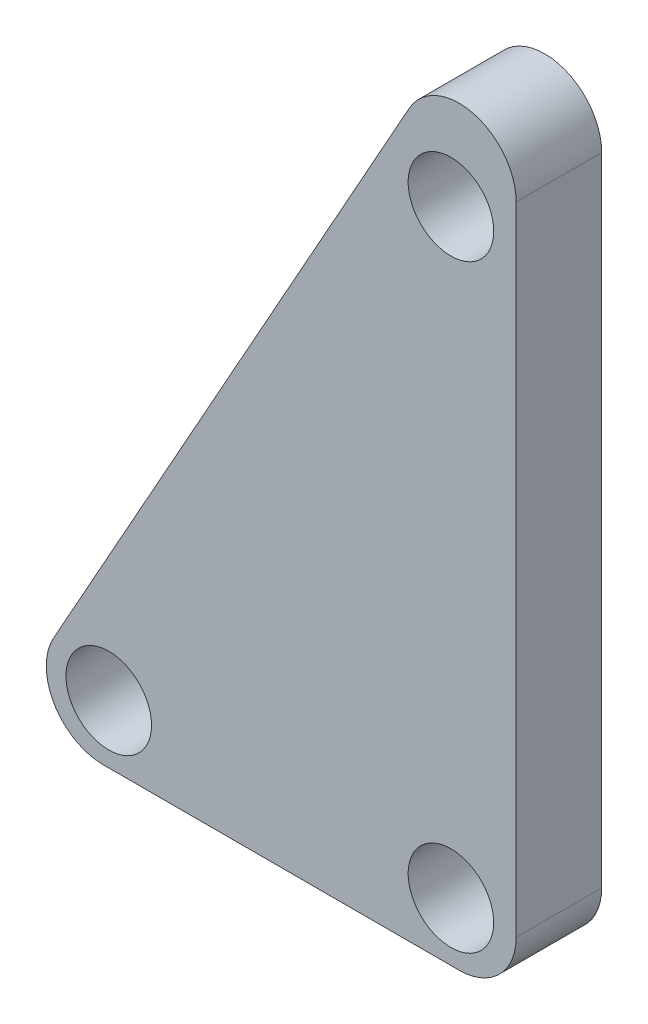
ISO-10303-21;
HEADER;
FILE_DESCRIPTION(('STEP AP214'),'2;1');
FILE_NAME('part.step','',(''),(''),'','','');
FILE_SCHEMA(('AUTOMOTIVE_DESIGN { 1 0 10303 214 1 1 1 1 }'));
ENDSEC;
DATA;
#1=APPLICATION_CONTEXT('core data for automotive mechanical design processes');
#2=APPLICATION_PROTOCOL_DEFINITION('international standard','automotive_design',2000,#1);
#3=PRODUCT_CONTEXT('',#1,'mechanical');
#4=PRODUCT('Part','Part','',(#3));
#5=PRODUCT_RELATED_PRODUCT_CATEGORY('part','',(#4));
#6=PRODUCT_DEFINITION_FORMATION('','',#4);
#7=PRODUCT_DEFINITION_CONTEXT('part definition',#1,'design');
#8=PRODUCT_DEFINITION('design','',#6,#7);
#9=PRODUCT_DEFINITION_SHAPE('','',#8);
#10=(LENGTH_UNIT() NAMED_UNIT(*) SI_UNIT(.MILLI.,.METRE.));
#11=(NAMED_UNIT(*) PLANE_ANGLE_UNIT() SI_UNIT($,.RADIAN.));
#12=(NAMED_UNIT(*) SI_UNIT($,.STERADIAN.) SOLID_ANGLE_UNIT());
#13=UNCERTAINTY_MEASURE_WITH_UNIT(LENGTH_MEASURE(1.E-05),#10,'distance_accuracy_value','');
#14=(GEOMETRIC_REPRESENTATION_CONTEXT(3) GLOBAL_UNCERTAINTY_ASSIGNED_CONTEXT((#13)) GLOBAL_UNIT_ASSIGNED_CONTEXT((#10,
#11,#12)) REPRESENTATION_CONTEXT('',''));
#15=CARTESIAN_POINT('',(0.,0.,0.));
#16=DIRECTION('',(0.,0.,1.));
#17=DIRECTION('',(1.,0.,0.));
#18=AXIS2_PLACEMENT_3D('',#15,#16,#17);
#19=CARTESIAN_POINT('',(-20.,243.342145584701,30.));
#20=DIRECTION('',(0.,0.,-1.));
#21=DIRECTION('',(-1.,0.,0.));
#22=AXIS2_PLACEMENT_3D('',#19,#20,#21);
#23=PLANE('',#22);
#24=CARTESIAN_POINT('',(-20.,243.342145584701,30.));
#25=DIRECTION('',(0.,0.,1.));
#26=DIRECTION('',(-1.,0.,0.));
#27=AXIS2_PLACEMENT_3D('',#24,#25,#26);
#28=CIRCLE('',#27,20.);
#29=CARTESIAN_POINT('',(0.,243.342145584701,30.));
#30=VERTEX_POINT('',#29);
#31=CARTESIAN_POINT('',(-37.4597186449705,253.097053315606,30.));
#32=VERTEX_POINT('',#31);
#33=EDGE_CURVE('E133',#30,#32,#28,.T.);
#34=ORIENTED_EDGE('',*,*,#33,.T.);
#35=DIRECTION('',(-0.487745386545245,-0.872985932248527,0.));
#36=VECTOR('',#35,1.);
#37=CARTESIAN_POINT('',(-162.243059482406,29.7549077309049,30.));
#38=LINE('',#37,#36);
#39=CARTESIAN_POINT('',(-162.243059482406,29.7549077309049,30.));
#40=VERTEX_POINT('',#39);
#41=EDGE_CURVE('E91',#32,#40,#38,.T.);
#42=ORIENTED_EDGE('',*,*,#41,.T.);
#43=CARTESIAN_POINT('',(-144.783340837436,20.,30.));
#44=DIRECTION('',(0.,0.,1.));
#45=DIRECTION('',(-1.,0.,0.));
#46=AXIS2_PLACEMENT_3D('',#43,#44,#45);
#47=CIRCLE('',#46,20.);
#48=CARTESIAN_POINT('',(-144.783340837436,0.,30.));
#49=VERTEX_POINT('',#48);
#50=EDGE_CURVE('E104',#40,#49,#47,.T.);
#51=ORIENTED_EDGE('',*,*,#50,.T.);
#52=DIRECTION('',(1.,0.,0.));
#53=VECTOR('',#52,1.);
#54=CARTESIAN_POINT('',(-20.0000000000001,0.,30.));
#55=LINE('',#54,#53);
#56=CARTESIAN_POINT('',(-20.0000000000001,0.,30.));
#57=VERTEX_POINT('',#56);
#58=EDGE_CURVE('E98',#49,#57,#55,.T.);
#59=ORIENTED_EDGE('',*,*,#58,.T.);
#60=CARTESIAN_POINT('',(-20.,20.,30.));
#61=DIRECTION('',(0.,0.,1.));
#62=DIRECTION('',(1.,0.,0.));
#63=AXIS2_PLACEMENT_3D('',#60,#61,#62);
#64=CIRCLE('',#63,20.);
#65=CARTESIAN_POINT('',(0.,20.,30.));
#66=VERTEX_POINT('',#65);
#67=EDGE_CURVE('E102',#57,#66,#64,.T.);
#68=ORIENTED_EDGE('',*,*,#67,.T.);
#69=DIRECTION('',(0.,1.,0.));
#70=VECTOR('',#69,1.);
#71=CARTESIAN_POINT('',(0.,243.342145584701,30.));
#72=LINE('',#71,#70);
#73=EDGE_CURVE('E54',#66,#30,#72,.T.);
#74=ORIENTED_EDGE('',*,*,#73,.T.);
#75=EDGE_LOOP('',(#34,#42,#51,#59,#68,#74));
#76=FACE_BOUND('',#75,.T.);
#77=CARTESIAN_POINT('',(-22.8788887645735,230.463472559632,30.));
#78=DIRECTION('',(0.,0.,1.));
#79=DIRECTION('',(1.,0.,0.));
#80=AXIS2_PLACEMENT_3D('',#77,#78,#79);
#81=CIRCLE('',#80,15.);
#82=CARTESIAN_POINT('',(-7.87888876457353,230.463472559632,30.));
#83=VERTEX_POINT('',#82);
#84=EDGE_CURVE('E126',#83,#83,#81,.T.);
#85=ORIENTED_EDGE('',*,*,#84,.F.);
#86=EDGE_LOOP('',(#85));
#87=FACE_BOUND('',#86,.T.);
#88=CARTESIAN_POINT('',(-22.8788887645735,20.463472559632,30.));
#89=DIRECTION('',(0.,0.,1.));
#90=DIRECTION('',(1.,0.,0.));
#91=AXIS2_PLACEMENT_3D('',#88,#89,#90);
#92=CIRCLE('',#91,15.);
#93=CARTESIAN_POINT('',(-7.8788887645735,20.463472559632,30.));
#94=VERTEX_POINT('',#93);
#95=EDGE_CURVE('E187',#94,#94,#92,.T.);
#96=ORIENTED_EDGE('',*,*,#95,.F.);
#97=EDGE_LOOP('',(#96));
#98=FACE_BOUND('',#97,.T.);
#99=CARTESIAN_POINT('',(-142.878888764574,20.463472559632,30.));
#100=DIRECTION('',(0.,0.,1.));
#101=DIRECTION('',(1.,0.,0.));
#102=AXIS2_PLACEMENT_3D('',#99,#100,#101);
#103=CIRCLE('',#102,15.);
#104=CARTESIAN_POINT('',(-127.878888764573,20.463472559632,30.));
#105=VERTEX_POINT('',#104);
#106=EDGE_CURVE('E178',#105,#105,#103,.T.);
#107=ORIENTED_EDGE('',*,*,#106,.F.);
#108=EDGE_LOOP('',(#107));
#109=FACE_BOUND('',#108,.T.);
#110=ADVANCED_FACE('F37',(#76,#87,#98,#109),#23,.F.);
#111=CARTESIAN_POINT('',(-20.,243.342145584701,0.));
#112=DIRECTION('',(0.,0.,-1.));
#113=DIRECTION('',(-1.,0.,0.));
#114=AXIS2_PLACEMENT_3D('',#111,#112,#113);
#115=PLANE('',#114);
#116=CARTESIAN_POINT('',(-22.8788887645735,20.463472559632,0.));
#117=DIRECTION('',(0.,0.,1.));
#118=DIRECTION('',(1.,0.,0.));
#119=AXIS2_PLACEMENT_3D('',#116,#117,#118);
#120=CIRCLE('',#119,15.);
#121=CARTESIAN_POINT('',(-7.8788887645735,20.463472559632,0.));
#122=VERTEX_POINT('',#121);
#123=EDGE_CURVE('E184',#122,#122,#120,.T.);
#124=ORIENTED_EDGE('',*,*,#123,.T.);
#125=EDGE_LOOP('',(#124));
#126=FACE_BOUND('',#125,.T.);
#127=CARTESIAN_POINT('',(-20.,243.342145584701,0.));
#128=DIRECTION('',(0.,0.,1.));
#129=DIRECTION('',(-1.,0.,0.));
#130=AXIS2_PLACEMENT_3D('',#127,#128,#129);
#131=CIRCLE('',#130,20.);
#132=CARTESIAN_POINT('',(0.,243.342145584701,0.));
#133=VERTEX_POINT('',#132);
#134=CARTESIAN_POINT('',(-37.4597186449705,253.097053315606,0.));
#135=VERTEX_POINT('',#134);
#136=EDGE_CURVE('E122',#133,#135,#131,.T.);
#137=ORIENTED_EDGE('',*,*,#136,.F.);
#138=DIRECTION('',(0.,1.,0.));
#139=VECTOR('',#138,1.);
#140=CARTESIAN_POINT('',(0.,243.342145584701,0.));
#141=LINE('',#140,#139);
#142=CARTESIAN_POINT('',(0.,20.,0.));
#143=VERTEX_POINT('',#142);
#144=EDGE_CURVE('E83',#143,#133,#141,.T.);
#145=ORIENTED_EDGE('',*,*,#144,.F.);
#146=CARTESIAN_POINT('',(-20.,20.,0.));
#147=DIRECTION('',(0.,0.,1.));
#148=DIRECTION('',(1.,0.,0.));
#149=AXIS2_PLACEMENT_3D('',#146,#147,#148);
#150=CIRCLE('',#149,20.);
#151=CARTESIAN_POINT('',(-20.0000000000001,0.,0.));
#152=VERTEX_POINT('',#151);
#153=EDGE_CURVE('E77',#152,#143,#150,.T.);
#154=ORIENTED_EDGE('',*,*,#153,.F.);
#155=DIRECTION('',(1.,0.,0.));
#156=VECTOR('',#155,1.);
#157=CARTESIAN_POINT('',(-20.0000000000001,0.,0.));
#158=LINE('',#157,#156);
#159=CARTESIAN_POINT('',(-144.783340837436,0.,0.));
#160=VERTEX_POINT('',#159);
#161=EDGE_CURVE('E112',#160,#152,#158,.T.);
#162=ORIENTED_EDGE('',*,*,#161,.F.);
#163=CARTESIAN_POINT('',(-144.783340837436,20.,0.));
#164=DIRECTION('',(0.,0.,1.));
#165=DIRECTION('',(-1.,0.,0.));
#166=AXIS2_PLACEMENT_3D('',#163,#164,#165);
#167=CIRCLE('',#166,20.);
#168=CARTESIAN_POINT('',(-162.243059482406,29.7549077309049,0.));
#169=VERTEX_POINT('',#168);
#170=EDGE_CURVE('E128',#169,#160,#167,.T.);
#171=ORIENTED_EDGE('',*,*,#170,.F.);
#172=DIRECTION('',(-0.487745386545245,-0.872985932248527,0.));
#173=VECTOR('',#172,1.);
#174=CARTESIAN_POINT('',(-162.243059482406,29.7549077309049,0.));
#175=LINE('',#174,#173);
#176=EDGE_CURVE('E125',#135,#169,#175,.T.);
#177=ORIENTED_EDGE('',*,*,#176,.F.);
#178=EDGE_LOOP('',(#137,#145,#154,#162,#171,#177));
#179=FACE_BOUND('',#178,.T.);
#180=CARTESIAN_POINT('',(-22.8788887645735,230.463472559632,0.));
#181=DIRECTION('',(0.,0.,1.));
#182=DIRECTION('',(1.,0.,0.));
#183=AXIS2_PLACEMENT_3D('',#180,#181,#182);
#184=CIRCLE('',#183,15.);
#185=CARTESIAN_POINT('',(-7.87888876457353,230.463472559632,0.));
#186=VERTEX_POINT('',#185);
#187=EDGE_CURVE('E190',#186,#186,#184,.T.);
#188=ORIENTED_EDGE('',*,*,#187,.T.);
#189=EDGE_LOOP('',(#188));
#190=FACE_BOUND('',#189,.T.);
#191=CARTESIAN_POINT('',(-142.878888764574,20.463472559632,0.));
#192=DIRECTION('',(0.,0.,1.));
#193=DIRECTION('',(1.,0.,0.));
#194=AXIS2_PLACEMENT_3D('',#191,#192,#193);
#195=CIRCLE('',#194,15.);
#196=CARTESIAN_POINT('',(-127.878888764573,20.463472559632,0.));
#197=VERTEX_POINT('',#196);
#198=EDGE_CURVE('E181',#197,#197,#195,.T.);
#199=ORIENTED_EDGE('',*,*,#198,.T.);
#200=EDGE_LOOP('',(#199));
#201=FACE_BOUND('',#200,.T.);
#202=ADVANCED_FACE('F142',(#126,#179,#190,#201),#115,.T.);
#203=CARTESIAN_POINT('',(-20.,243.342145584701,30.));
#204=DIRECTION('',(0.,0.,-1.));
#205=DIRECTION('',(-1.,0.,0.));
#206=AXIS2_PLACEMENT_3D('',#203,#204,#205);
#207=CYLINDRICAL_SURFACE('',#206,20.);
#208=ORIENTED_EDGE('',*,*,#136,.T.);
#209=DIRECTION('',(0.,0.,-1.));
#210=VECTOR('',#209,1.);
#211=CARTESIAN_POINT('',(-37.4597186449705,253.097053315606,30.));
#212=LINE('',#211,#210);
#213=EDGE_CURVE('E11',#32,#135,#212,.T.);
#214=ORIENTED_EDGE('',*,*,#213,.F.);
#215=ORIENTED_EDGE('',*,*,#33,.F.);
#216=DIRECTION('',(0.,0.,-1.));
#217=VECTOR('',#216,1.);
#218=CARTESIAN_POINT('',(0.,243.342145584701,30.));
#219=LINE('',#218,#217);
#220=EDGE_CURVE('E118',#30,#133,#219,.T.);
#221=ORIENTED_EDGE('',*,*,#220,.T.);
#222=EDGE_LOOP('',(#208,#214,#215,#221));
#223=FACE_BOUND('',#222,.T.);
#224=ADVANCED_FACE('F39',(#223),#207,.T.);
#225=CARTESIAN_POINT('',(-162.243059482406,29.7549077309049,30.));
#226=DIRECTION('',(0.872985932248527,-0.487745386545245,0.));
#227=DIRECTION('',(0.487745386545245,0.872985932248527,0.));
#228=AXIS2_PLACEMENT_3D('',#225,#226,#227);
#229=PLANE('',#228);
#230=ORIENTED_EDGE('',*,*,#176,.T.);
#231=DIRECTION('',(0.,0.,-1.));
#232=VECTOR('',#231,1.);
#233=CARTESIAN_POINT('',(-162.243059482406,29.7549077309049,30.));
#234=LINE('',#233,#232);
#235=EDGE_CURVE('E46',#40,#169,#234,.T.);
#236=ORIENTED_EDGE('',*,*,#235,.F.);
#237=ORIENTED_EDGE('',*,*,#41,.F.);
#238=ORIENTED_EDGE('',*,*,#213,.T.);
#239=EDGE_LOOP('',(#230,#236,#237,#238));
#240=FACE_BOUND('',#239,.T.);
#241=ADVANCED_FACE('F245',(#240),#229,.F.);
#242=CARTESIAN_POINT('',(-144.783340837436,20.,30.));
#243=DIRECTION('',(0.,0.,-1.));
#244=DIRECTION('',(-1.,0.,0.));
#245=AXIS2_PLACEMENT_3D('',#242,#243,#244);
#246=CYLINDRICAL_SURFACE('',#245,20.);
#247=ORIENTED_EDGE('',*,*,#170,.T.);
#248=DIRECTION('',(0.,0.,-1.));
#249=VECTOR('',#248,1.);
#250=CARTESIAN_POINT('',(-144.783340837436,0.,30.));
#251=LINE('',#250,#249);
#252=EDGE_CURVE('E113',#49,#160,#251,.T.);
#253=ORIENTED_EDGE('',*,*,#252,.F.);
#254=ORIENTED_EDGE('',*,*,#50,.F.);
#255=ORIENTED_EDGE('',*,*,#235,.T.);
#256=EDGE_LOOP('',(#247,#253,#254,#255));
#257=FACE_BOUND('',#256,.T.);
#258=ADVANCED_FACE('F139',(#257),#246,.T.);
#259=CARTESIAN_POINT('',(-20.0000000000001,0.,30.));
#260=DIRECTION('',(0.,1.,0.));
#261=DIRECTION('',(0.,0.,1.));
#262=AXIS2_PLACEMENT_3D('',#259,#260,#261);
#263=PLANE('',#262);
#264=ORIENTED_EDGE('',*,*,#161,.T.);
#265=DIRECTION('',(0.,0.,-1.));
#266=VECTOR('',#265,1.);
#267=CARTESIAN_POINT('',(-20.0000000000001,0.,30.));
#268=LINE('',#267,#266);
#269=EDGE_CURVE('E109',#57,#152,#268,.T.);
#270=ORIENTED_EDGE('',*,*,#269,.F.);
#271=ORIENTED_EDGE('',*,*,#58,.F.);
#272=ORIENTED_EDGE('',*,*,#252,.T.);
#273=EDGE_LOOP('',(#264,#270,#271,#272));
#274=FACE_BOUND('',#273,.T.);
#275=ADVANCED_FACE('F110',(#274),#263,.F.);
#276=CARTESIAN_POINT('',(-20.,20.,30.));
#277=DIRECTION('',(0.,0.,-1.));
#278=DIRECTION('',(-1.,0.,0.));
#279=AXIS2_PLACEMENT_3D('',#276,#277,#278);
#280=CYLINDRICAL_SURFACE('',#279,20.);
#281=ORIENTED_EDGE('',*,*,#153,.T.);
#282=DIRECTION('',(0.,0.,-1.));
#283=VECTOR('',#282,1.);
#284=CARTESIAN_POINT('',(0.,20.,30.));
#285=LINE('',#284,#283);
#286=EDGE_CURVE('E114',#66,#143,#285,.T.);
#287=ORIENTED_EDGE('',*,*,#286,.F.);
#288=ORIENTED_EDGE('',*,*,#67,.F.);
#289=ORIENTED_EDGE('',*,*,#269,.T.);
#290=EDGE_LOOP('',(#281,#287,#288,#289));
#291=FACE_BOUND('',#290,.T.);
#292=ADVANCED_FACE('F116',(#291),#280,.T.);
#293=CARTESIAN_POINT('',(0.,243.342145584701,30.));
#294=DIRECTION('',(-1.,0.,0.));
#295=DIRECTION('',(0.,0.,1.));
#296=AXIS2_PLACEMENT_3D('',#293,#294,#295);
#297=PLANE('',#296);
#298=ORIENTED_EDGE('',*,*,#144,.T.);
#299=ORIENTED_EDGE('',*,*,#220,.F.);
#300=ORIENTED_EDGE('',*,*,#73,.F.);
#301=ORIENTED_EDGE('',*,*,#286,.T.);
#302=EDGE_LOOP('',(#298,#299,#300,#301));
#303=FACE_BOUND('',#302,.T.);
#304=ADVANCED_FACE('F147',(#303),#297,.F.);
#305=CARTESIAN_POINT('',(-22.8788887645735,230.463472559632,30.));
#306=DIRECTION('',(0.,0.,-1.));
#307=DIRECTION('',(-1.,0.,0.));
#308=AXIS2_PLACEMENT_3D('',#305,#306,#307);
#309=CYLINDRICAL_SURFACE('',#308,15.);
#310=ORIENTED_EDGE('',*,*,#84,.T.);
#311=EDGE_LOOP('',(#310));
#312=FACE_BOUND('',#311,.T.);
#313=ORIENTED_EDGE('',*,*,#187,.F.);
#314=EDGE_LOOP('',(#313));
#315=FACE_BOUND('',#314,.T.);
#316=ADVANCED_FACE('F149',(#312,#315),#309,.F.);
#317=CARTESIAN_POINT('',(-22.8788887645735,20.463472559632,30.));
#318=DIRECTION('',(0.,0.,-1.));
#319=DIRECTION('',(-1.,0.,0.));
#320=AXIS2_PLACEMENT_3D('',#317,#318,#319);
#321=CYLINDRICAL_SURFACE('',#320,15.);
#322=ORIENTED_EDGE('',*,*,#95,.T.);
#323=EDGE_LOOP('',(#322));
#324=FACE_BOUND('',#323,.T.);
#325=ORIENTED_EDGE('',*,*,#123,.F.);
#326=EDGE_LOOP('',(#325));
#327=FACE_BOUND('',#326,.T.);
#328=ADVANCED_FACE('F155',(#324,#327),#321,.F.);
#329=CARTESIAN_POINT('',(-142.878888764574,20.463472559632,30.));
#330=DIRECTION('',(0.,0.,-1.));
#331=DIRECTION('',(-1.,0.,0.));
#332=AXIS2_PLACEMENT_3D('',#329,#330,#331);
#333=CYLINDRICAL_SURFACE('',#332,15.);
#334=ORIENTED_EDGE('',*,*,#106,.T.);
#335=EDGE_LOOP('',(#334));
#336=FACE_BOUND('',#335,.T.);
#337=ORIENTED_EDGE('',*,*,#198,.F.);
#338=EDGE_LOOP('',(#337));
#339=FACE_BOUND('',#338,.T.);
#340=ADVANCED_FACE('F169',(#336,#339),#333,.F.);
#341=CLOSED_SHELL('',(#110,#202,#224,#241,#258,#275,#292,#304,#316,#328,#340));
#342=MANIFOLD_SOLID_BREP('B2',#341);
#343=ADVANCED_BREP_SHAPE_REPRESENTATION('',(#18,#342),#14);
#344=SHAPE_DEFINITION_REPRESENTATION(#9,#343);
ENDSEC;
END-ISO-10303-21;
